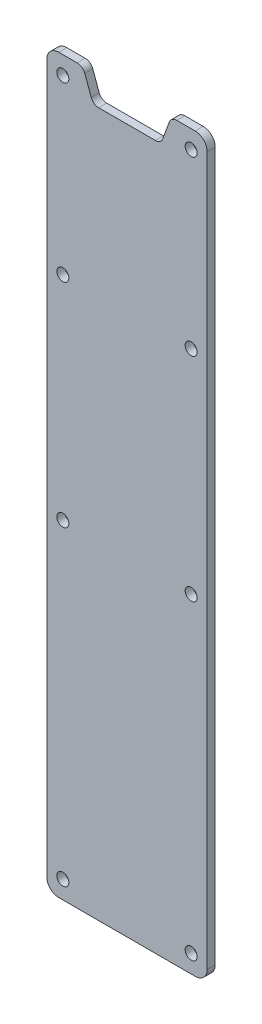
ISO-10303-21;
HEADER;
FILE_DESCRIPTION(('STEP AP214'),'2;1');
FILE_NAME('part.step','',(''),(''),'','','');
FILE_SCHEMA(('AUTOMOTIVE_DESIGN { 1 0 10303 214 1 1 1 1 }'));
ENDSEC;
DATA;
#1=APPLICATION_CONTEXT('core data for automotive mechanical design processes');
#2=APPLICATION_PROTOCOL_DEFINITION('international standard','automotive_design',2000,#1);
#3=PRODUCT_CONTEXT('',#1,'mechanical');
#4=PRODUCT('Part','Part','',(#3));
#5=PRODUCT_RELATED_PRODUCT_CATEGORY('part','',(#4));
#6=PRODUCT_DEFINITION_FORMATION('','',#4);
#7=PRODUCT_DEFINITION_CONTEXT('part definition',#1,'design');
#8=PRODUCT_DEFINITION('design','',#6,#7);
#9=PRODUCT_DEFINITION_SHAPE('','',#8);
#10=(LENGTH_UNIT() NAMED_UNIT(*) SI_UNIT(.MILLI.,.METRE.));
#11=(NAMED_UNIT(*) PLANE_ANGLE_UNIT() SI_UNIT($,.RADIAN.));
#12=(NAMED_UNIT(*) SI_UNIT($,.STERADIAN.) SOLID_ANGLE_UNIT());
#13=UNCERTAINTY_MEASURE_WITH_UNIT(LENGTH_MEASURE(1.E-05),#10,'distance_accuracy_value','');
#14=(GEOMETRIC_REPRESENTATION_CONTEXT(3) GLOBAL_UNCERTAINTY_ASSIGNED_CONTEXT((#13)) GLOBAL_UNIT_ASSIGNED_CONTEXT((#10,
#11,#12)) REPRESENTATION_CONTEXT('',''));
#15=CARTESIAN_POINT('',(0.,0.,0.));
#16=DIRECTION('',(0.,0.,1.));
#17=DIRECTION('',(1.,0.,0.));
#18=AXIS2_PLACEMENT_3D('',#15,#16,#17);
#19=CARTESIAN_POINT('',(17.,85.75,2.));
#20=DIRECTION('',(0.,0.,-1.));
#21=DIRECTION('',(-1.,0.,0.));
#22=AXIS2_PLACEMENT_3D('',#19,#20,#21);
#23=PLANE('',#22);
#24=CARTESIAN_POINT('',(-16.,84.25,2.));
#25=DIRECTION('',(0.,0.,1.));
#26=DIRECTION('',(1.,0.,0.));
#27=AXIS2_PLACEMENT_3D('',#24,#25,#26);
#28=CIRCLE('',#27,1.5);
#29=CARTESIAN_POINT('',(-14.5,84.25,2.));
#30=VERTEX_POINT('',#29);
#31=EDGE_CURVE('E202',#30,#30,#28,.T.);
#32=ORIENTED_EDGE('',*,*,#31,.F.);
#33=EDGE_LOOP('',(#32));
#34=FACE_BOUND('',#33,.T.);
#35=CARTESIAN_POINT('',(16.,84.25,2.));
#36=DIRECTION('',(0.,0.,1.));
#37=DIRECTION('',(1.,0.,0.));
#38=AXIS2_PLACEMENT_3D('',#35,#36,#37);
#39=CIRCLE('',#38,1.5);
#40=CARTESIAN_POINT('',(17.5,84.25,2.));
#41=VERTEX_POINT('',#40);
#42=EDGE_CURVE('E196',#41,#41,#39,.T.);
#43=ORIENTED_EDGE('',*,*,#42,.F.);
#44=EDGE_LOOP('',(#43));
#45=FACE_BOUND('',#44,.T.);
#46=CARTESIAN_POINT('',(-16.,41.25,2.));
#47=DIRECTION('',(0.,0.,1.));
#48=DIRECTION('',(1.,0.,0.));
#49=AXIS2_PLACEMENT_3D('',#46,#47,#48);
#50=CIRCLE('',#49,1.5);
#51=CARTESIAN_POINT('',(-14.5,41.25,2.));
#52=VERTEX_POINT('',#51);
#53=EDGE_CURVE('E190',#52,#52,#50,.T.);
#54=ORIENTED_EDGE('',*,*,#53,.F.);
#55=EDGE_LOOP('',(#54));
#56=FACE_BOUND('',#55,.T.);
#57=CARTESIAN_POINT('',(16.,41.25,2.));
#58=DIRECTION('',(0.,0.,1.));
#59=DIRECTION('',(1.,0.,0.));
#60=AXIS2_PLACEMENT_3D('',#57,#58,#59);
#61=CIRCLE('',#60,1.5);
#62=CARTESIAN_POINT('',(17.5,41.25,2.));
#63=VERTEX_POINT('',#62);
#64=EDGE_CURVE('E184',#63,#63,#61,.T.);
#65=ORIENTED_EDGE('',*,*,#64,.F.);
#66=EDGE_LOOP('',(#65));
#67=FACE_BOUND('',#66,.T.);
#68=CARTESIAN_POINT('',(-16.,-11.75,2.));
#69=DIRECTION('',(0.,0.,1.));
#70=DIRECTION('',(1.,0.,0.));
#71=AXIS2_PLACEMENT_3D('',#68,#69,#70);
#72=CIRCLE('',#71,1.5);
#73=CARTESIAN_POINT('',(-14.5,-11.75,2.));
#74=VERTEX_POINT('',#73);
#75=EDGE_CURVE('E178',#74,#74,#72,.T.);
#76=ORIENTED_EDGE('',*,*,#75,.F.);
#77=EDGE_LOOP('',(#76));
#78=FACE_BOUND('',#77,.T.);
#79=CARTESIAN_POINT('',(16.,-11.75,2.));
#80=DIRECTION('',(0.,0.,1.));
#81=DIRECTION('',(1.,0.,0.));
#82=AXIS2_PLACEMENT_3D('',#79,#80,#81);
#83=CIRCLE('',#82,1.5);
#84=CARTESIAN_POINT('',(17.5,-11.75,2.));
#85=VERTEX_POINT('',#84);
#86=EDGE_CURVE('E172',#85,#85,#83,.T.);
#87=ORIENTED_EDGE('',*,*,#86,.F.);
#88=EDGE_LOOP('',(#87));
#89=FACE_BOUND('',#88,.T.);
#90=CARTESIAN_POINT('',(-16.,-89.25,2.));
#91=DIRECTION('',(0.,0.,1.));
#92=DIRECTION('',(1.,0.,0.));
#93=AXIS2_PLACEMENT_3D('',#90,#91,#92);
#94=CIRCLE('',#93,1.5);
#95=CARTESIAN_POINT('',(-14.5,-89.25,2.));
#96=VERTEX_POINT('',#95);
#97=EDGE_CURVE('E166',#96,#96,#94,.T.);
#98=ORIENTED_EDGE('',*,*,#97,.F.);
#99=EDGE_LOOP('',(#98));
#100=FACE_BOUND('',#99,.T.);
#101=CARTESIAN_POINT('',(16.,-89.25,2.));
#102=DIRECTION('',(0.,0.,1.));
#103=DIRECTION('',(1.,0.,0.));
#104=AXIS2_PLACEMENT_3D('',#101,#102,#103);
#105=CIRCLE('',#104,1.5);
#106=CARTESIAN_POINT('',(17.5,-89.25,2.));
#107=VERTEX_POINT('',#106);
#108=EDGE_CURVE('E160',#107,#107,#105,.T.);
#109=ORIENTED_EDGE('',*,*,#108,.F.);
#110=EDGE_LOOP('',(#109));
#111=FACE_BOUND('',#110,.T.);
#112=DIRECTION('',(-1.,0.,0.));
#113=VECTOR('',#112,1.);
#114=CARTESIAN_POINT('',(-17.,88.75,2.));
#115=LINE('',#114,#113);
#116=CARTESIAN_POINT('',(17.,88.75,2.));
#117=VERTEX_POINT('',#116);
#118=CARTESIAN_POINT('',(12.4004150764194,88.75,2.));
#119=VERTEX_POINT('',#118);
#120=EDGE_CURVE('E112',#117,#119,#115,.T.);
#121=ORIENTED_EDGE('',*,*,#120,.T.);
#122=CARTESIAN_POINT('',(12.4004150764194,86.75,2.));
#123=DIRECTION('',(0.,0.,1.));
#124=DIRECTION('',(1.,0.,0.));
#125=AXIS2_PLACEMENT_3D('',#122,#123,#124);
#126=CIRCLE('',#125,2.);
#127=CARTESIAN_POINT('',(10.5210298348476,87.4340402866513,2.));
#128=VERTEX_POINT('',#127);
#129=EDGE_CURVE('E37',#128,#119,#126,.F.);
#130=ORIENTED_EDGE('',*,*,#129,.F.);
#131=DIRECTION('',(0.342020143325666,0.939692620785909,0.));
#132=VECTOR('',#131,1.);
#133=CARTESIAN_POINT('',(-18.8104557426856,6.84644598331924,2.));
#134=LINE('',#133,#132);
#135=CARTESIAN_POINT('',(8.93117852528898,83.0659597133486,2.));
#136=VERTEX_POINT('',#135);
#137=EDGE_CURVE('E85',#136,#128,#134,.T.);
#138=ORIENTED_EDGE('',*,*,#137,.F.);
#139=CARTESIAN_POINT('',(7.05179328371717,83.75,2.));
#140=DIRECTION('',(0.,0.,1.));
#141=DIRECTION('',(1.,0.,0.));
#142=AXIS2_PLACEMENT_3D('',#139,#140,#141);
#143=CIRCLE('',#142,2.);
#144=CARTESIAN_POINT('',(7.05179328371716,81.75,2.));
#145=VERTEX_POINT('',#144);
#146=EDGE_CURVE('E98',#145,#136,#143,.T.);
#147=ORIENTED_EDGE('',*,*,#146,.F.);
#148=DIRECTION('',(1.,0.,0.));
#149=VECTOR('',#148,1.);
#150=CARTESIAN_POINT('',(0.,81.75,2.));
#151=LINE('',#150,#149);
#152=CARTESIAN_POINT('',(-7.05179328371718,81.75,2.));
#153=VERTEX_POINT('',#152);
#154=EDGE_CURVE('E124',#153,#145,#151,.T.);
#155=ORIENTED_EDGE('',*,*,#154,.F.);
#156=CARTESIAN_POINT('',(-7.05179328371718,83.75,2.));
#157=DIRECTION('',(0.,0.,1.));
#158=DIRECTION('',(1.,0.,0.));
#159=AXIS2_PLACEMENT_3D('',#156,#157,#158);
#160=CIRCLE('',#159,2.);
#161=CARTESIAN_POINT('',(-8.931178525289,83.0659597133486,2.));
#162=VERTEX_POINT('',#161);
#163=EDGE_CURVE('E115',#162,#153,#160,.T.);
#164=ORIENTED_EDGE('',*,*,#163,.F.);
#165=DIRECTION('',(0.342020143325666,-0.939692620785909,0.));
#166=VECTOR('',#165,1.);
#167=CARTESIAN_POINT('',(18.8104557426856,6.84644598331925,2.));
#168=LINE('',#167,#166);
#169=CARTESIAN_POINT('',(-10.5210298348476,87.4340402866513,2.));
#170=VERTEX_POINT('',#169);
#171=EDGE_CURVE('E113',#170,#162,#168,.T.);
#172=ORIENTED_EDGE('',*,*,#171,.F.);
#173=CARTESIAN_POINT('',(-12.4004150764194,86.75,2.));
#174=DIRECTION('',(0.,0.,1.));
#175=DIRECTION('',(1.,0.,0.));
#176=AXIS2_PLACEMENT_3D('',#173,#174,#175);
#177=CIRCLE('',#176,2.);
#178=CARTESIAN_POINT('',(-12.4004150764194,88.75,2.));
#179=VERTEX_POINT('',#178);
#180=EDGE_CURVE('E114',#179,#170,#177,.F.);
#181=ORIENTED_EDGE('',*,*,#180,.F.);
#182=CARTESIAN_POINT('',(-17.,88.75,2.));
#183=VERTEX_POINT('',#182);
#184=EDGE_CURVE('E210',#179,#183,#115,.T.);
#185=ORIENTED_EDGE('',*,*,#184,.T.);
#186=CARTESIAN_POINT('',(-17.,85.75,2.));
#187=DIRECTION('',(0.,0.,1.));
#188=DIRECTION('',(1.,0.,0.));
#189=AXIS2_PLACEMENT_3D('',#186,#187,#188);
#190=CIRCLE('',#189,3.);
#191=CARTESIAN_POINT('',(-20.,85.75,2.));
#192=VERTEX_POINT('',#191);
#193=EDGE_CURVE('E214',#183,#192,#190,.T.);
#194=ORIENTED_EDGE('',*,*,#193,.T.);
#195=DIRECTION('',(0.,-1.,0.));
#196=VECTOR('',#195,1.);
#197=CARTESIAN_POINT('',(-20.,85.75,2.));
#198=LINE('',#197,#196);
#199=CARTESIAN_POINT('',(-20.,-90.75,2.));
#200=VERTEX_POINT('',#199);
#201=EDGE_CURVE('E217',#192,#200,#198,.T.);
#202=ORIENTED_EDGE('',*,*,#201,.T.);
#203=CARTESIAN_POINT('',(-17.,-90.75,2.));
#204=DIRECTION('',(0.,0.,1.));
#205=DIRECTION('',(1.,0.,0.));
#206=AXIS2_PLACEMENT_3D('',#203,#204,#205);
#207=CIRCLE('',#206,3.);
#208=CARTESIAN_POINT('',(-17.,-93.75,2.));
#209=VERTEX_POINT('',#208);
#210=EDGE_CURVE('E220',#200,#209,#207,.T.);
#211=ORIENTED_EDGE('',*,*,#210,.T.);
#212=DIRECTION('',(1.,0.,0.));
#213=VECTOR('',#212,1.);
#214=CARTESIAN_POINT('',(-17.,-93.75,2.));
#215=LINE('',#214,#213);
#216=CARTESIAN_POINT('',(17.,-93.75,2.));
#217=VERTEX_POINT('',#216);
#218=EDGE_CURVE('E223',#209,#217,#215,.T.);
#219=ORIENTED_EDGE('',*,*,#218,.T.);
#220=CARTESIAN_POINT('',(17.,-90.75,2.));
#221=DIRECTION('',(0.,0.,1.));
#222=DIRECTION('',(1.,0.,0.));
#223=AXIS2_PLACEMENT_3D('',#220,#221,#222);
#224=CIRCLE('',#223,3.);
#225=CARTESIAN_POINT('',(20.,-90.75,2.));
#226=VERTEX_POINT('',#225);
#227=EDGE_CURVE('E226',#217,#226,#224,.T.);
#228=ORIENTED_EDGE('',*,*,#227,.T.);
#229=DIRECTION('',(0.,1.,0.));
#230=VECTOR('',#229,1.);
#231=CARTESIAN_POINT('',(20.,85.75,2.));
#232=LINE('',#231,#230);
#233=CARTESIAN_POINT('',(20.,85.75,2.));
#234=VERTEX_POINT('',#233);
#235=EDGE_CURVE('E229',#226,#234,#232,.T.);
#236=ORIENTED_EDGE('',*,*,#235,.T.);
#237=CARTESIAN_POINT('',(17.,85.75,2.));
#238=DIRECTION('',(0.,0.,1.));
#239=DIRECTION('',(-1.,0.,0.));
#240=AXIS2_PLACEMENT_3D('',#237,#238,#239);
#241=CIRCLE('',#240,3.);
#242=EDGE_CURVE('E208',#234,#117,#241,.T.);
#243=ORIENTED_EDGE('',*,*,#242,.T.);
#244=EDGE_LOOP('',(#121,#130,#138,#147,#155,#164,#172,#181,#185,#194,#202,#211,#219,#228,#236,#243));
#245=FACE_BOUND('',#244,.T.);
#246=ADVANCED_FACE('F33',(#34,#45,#56,#67,#78,#89,#100,#111,#245),#23,.F.);
#247=CARTESIAN_POINT('',(17.,85.75,0.));
#248=DIRECTION('',(0.,0.,-1.));
#249=DIRECTION('',(-1.,0.,0.));
#250=AXIS2_PLACEMENT_3D('',#247,#248,#249);
#251=PLANE('',#250);
#252=CARTESIAN_POINT('',(16.,-89.25,0.));
#253=DIRECTION('',(0.,0.,1.));
#254=DIRECTION('',(1.,0.,0.));
#255=AXIS2_PLACEMENT_3D('',#252,#253,#254);
#256=CIRCLE('',#255,1.5);
#257=CARTESIAN_POINT('',(17.5,-89.25,0.));
#258=VERTEX_POINT('',#257);
#259=EDGE_CURVE('E97',#258,#258,#256,.T.);
#260=ORIENTED_EDGE('',*,*,#259,.T.);
#261=EDGE_LOOP('',(#260));
#262=FACE_BOUND('',#261,.T.);
#263=CARTESIAN_POINT('',(16.,-11.75,0.));
#264=DIRECTION('',(0.,0.,1.));
#265=DIRECTION('',(1.,0.,0.));
#266=AXIS2_PLACEMENT_3D('',#263,#264,#265);
#267=CIRCLE('',#266,1.5);
#268=CARTESIAN_POINT('',(17.5,-11.75,0.));
#269=VERTEX_POINT('',#268);
#270=EDGE_CURVE('E169',#269,#269,#267,.T.);
#271=ORIENTED_EDGE('',*,*,#270,.T.);
#272=EDGE_LOOP('',(#271));
#273=FACE_BOUND('',#272,.T.);
#274=CARTESIAN_POINT('',(16.,41.25,0.));
#275=DIRECTION('',(0.,0.,1.));
#276=DIRECTION('',(1.,0.,0.));
#277=AXIS2_PLACEMENT_3D('',#274,#275,#276);
#278=CIRCLE('',#277,1.5);
#279=CARTESIAN_POINT('',(17.5,41.25,0.));
#280=VERTEX_POINT('',#279);
#281=EDGE_CURVE('E181',#280,#280,#278,.T.);
#282=ORIENTED_EDGE('',*,*,#281,.T.);
#283=EDGE_LOOP('',(#282));
#284=FACE_BOUND('',#283,.T.);
#285=CARTESIAN_POINT('',(16.,84.25,0.));
#286=DIRECTION('',(0.,0.,1.));
#287=DIRECTION('',(1.,0.,0.));
#288=AXIS2_PLACEMENT_3D('',#285,#286,#287);
#289=CIRCLE('',#288,1.5);
#290=CARTESIAN_POINT('',(17.5,84.25,0.));
#291=VERTEX_POINT('',#290);
#292=EDGE_CURVE('E193',#291,#291,#289,.T.);
#293=ORIENTED_EDGE('',*,*,#292,.T.);
#294=EDGE_LOOP('',(#293));
#295=FACE_BOUND('',#294,.T.);
#296=CARTESIAN_POINT('',(-16.,84.25,0.));
#297=DIRECTION('',(0.,0.,1.));
#298=DIRECTION('',(1.,0.,0.));
#299=AXIS2_PLACEMENT_3D('',#296,#297,#298);
#300=CIRCLE('',#299,1.5);
#301=CARTESIAN_POINT('',(-14.5,84.25,0.));
#302=VERTEX_POINT('',#301);
#303=EDGE_CURVE('E199',#302,#302,#300,.T.);
#304=ORIENTED_EDGE('',*,*,#303,.T.);
#305=EDGE_LOOP('',(#304));
#306=FACE_BOUND('',#305,.T.);
#307=CARTESIAN_POINT('',(-16.,41.25,0.));
#308=DIRECTION('',(0.,0.,1.));
#309=DIRECTION('',(1.,0.,0.));
#310=AXIS2_PLACEMENT_3D('',#307,#308,#309);
#311=CIRCLE('',#310,1.5);
#312=CARTESIAN_POINT('',(-14.5,41.25,0.));
#313=VERTEX_POINT('',#312);
#314=EDGE_CURVE('E187',#313,#313,#311,.T.);
#315=ORIENTED_EDGE('',*,*,#314,.T.);
#316=EDGE_LOOP('',(#315));
#317=FACE_BOUND('',#316,.T.);
#318=CARTESIAN_POINT('',(-16.,-11.75,0.));
#319=DIRECTION('',(0.,0.,1.));
#320=DIRECTION('',(1.,0.,0.));
#321=AXIS2_PLACEMENT_3D('',#318,#319,#320);
#322=CIRCLE('',#321,1.5);
#323=CARTESIAN_POINT('',(-14.5,-11.75,0.));
#324=VERTEX_POINT('',#323);
#325=EDGE_CURVE('E175',#324,#324,#322,.T.);
#326=ORIENTED_EDGE('',*,*,#325,.T.);
#327=EDGE_LOOP('',(#326));
#328=FACE_BOUND('',#327,.T.);
#329=CARTESIAN_POINT('',(-16.,-89.25,0.));
#330=DIRECTION('',(0.,0.,1.));
#331=DIRECTION('',(1.,0.,0.));
#332=AXIS2_PLACEMENT_3D('',#329,#330,#331);
#333=CIRCLE('',#332,1.5);
#334=CARTESIAN_POINT('',(-14.5,-89.25,0.));
#335=VERTEX_POINT('',#334);
#336=EDGE_CURVE('E163',#335,#335,#333,.T.);
#337=ORIENTED_EDGE('',*,*,#336,.T.);
#338=EDGE_LOOP('',(#337));
#339=FACE_BOUND('',#338,.T.);
#340=CARTESIAN_POINT('',(12.4004150764194,86.75,0.));
#341=DIRECTION('',(0.,0.,1.));
#342=DIRECTION('',(1.,0.,0.));
#343=AXIS2_PLACEMENT_3D('',#340,#341,#342);
#344=CIRCLE('',#343,2.);
#345=CARTESIAN_POINT('',(10.5210298348476,87.4340402866513,0.));
#346=VERTEX_POINT('',#345);
#347=CARTESIAN_POINT('',(12.4004150764194,88.75,0.));
#348=VERTEX_POINT('',#347);
#349=EDGE_CURVE('E105',#346,#348,#344,.F.);
#350=ORIENTED_EDGE('',*,*,#349,.T.);
#351=DIRECTION('',(-1.,0.,0.));
#352=VECTOR('',#351,1.);
#353=CARTESIAN_POINT('',(-17.,88.75,0.));
#354=LINE('',#353,#352);
#355=CARTESIAN_POINT('',(17.,88.75,0.));
#356=VERTEX_POINT('',#355);
#357=EDGE_CURVE('E235',#356,#348,#354,.T.);
#358=ORIENTED_EDGE('',*,*,#357,.F.);
#359=CARTESIAN_POINT('',(17.,85.75,0.));
#360=DIRECTION('',(0.,0.,1.));
#361=DIRECTION('',(-1.,0.,0.));
#362=AXIS2_PLACEMENT_3D('',#359,#360,#361);
#363=CIRCLE('',#362,3.);
#364=CARTESIAN_POINT('',(20.,85.75,0.));
#365=VERTEX_POINT('',#364);
#366=EDGE_CURVE('E205',#365,#356,#363,.T.);
#367=ORIENTED_EDGE('',*,*,#366,.F.);
#368=DIRECTION('',(0.,1.,0.));
#369=VECTOR('',#368,1.);
#370=CARTESIAN_POINT('',(20.,85.75,0.));
#371=LINE('',#370,#369);
#372=CARTESIAN_POINT('',(20.,-90.75,0.));
#373=VERTEX_POINT('',#372);
#374=EDGE_CURVE('E211',#373,#365,#371,.T.);
#375=ORIENTED_EDGE('',*,*,#374,.F.);
#376=CARTESIAN_POINT('',(17.,-90.75,0.));
#377=DIRECTION('',(0.,0.,1.));
#378=DIRECTION('',(1.,0.,0.));
#379=AXIS2_PLACEMENT_3D('',#376,#377,#378);
#380=CIRCLE('',#379,3.);
#381=CARTESIAN_POINT('',(17.,-93.75,0.));
#382=VERTEX_POINT('',#381);
#383=EDGE_CURVE('E250',#382,#373,#380,.T.);
#384=ORIENTED_EDGE('',*,*,#383,.F.);
#385=DIRECTION('',(1.,0.,0.));
#386=VECTOR('',#385,1.);
#387=CARTESIAN_POINT('',(-17.,-93.75,0.));
#388=LINE('',#387,#386);
#389=CARTESIAN_POINT('',(-17.,-93.75,0.));
#390=VERTEX_POINT('',#389);
#391=EDGE_CURVE('E247',#390,#382,#388,.T.);
#392=ORIENTED_EDGE('',*,*,#391,.F.);
#393=CARTESIAN_POINT('',(-17.,-90.75,0.));
#394=DIRECTION('',(0.,0.,1.));
#395=DIRECTION('',(1.,0.,0.));
#396=AXIS2_PLACEMENT_3D('',#393,#394,#395);
#397=CIRCLE('',#396,3.);
#398=CARTESIAN_POINT('',(-20.,-90.75,0.));
#399=VERTEX_POINT('',#398);
#400=EDGE_CURVE('E244',#399,#390,#397,.T.);
#401=ORIENTED_EDGE('',*,*,#400,.F.);
#402=DIRECTION('',(0.,-1.,0.));
#403=VECTOR('',#402,1.);
#404=CARTESIAN_POINT('',(-20.,85.75,0.));
#405=LINE('',#404,#403);
#406=CARTESIAN_POINT('',(-20.,85.75,0.));
#407=VERTEX_POINT('',#406);
#408=EDGE_CURVE('E241',#407,#399,#405,.T.);
#409=ORIENTED_EDGE('',*,*,#408,.F.);
#410=CARTESIAN_POINT('',(-17.,85.75,0.));
#411=DIRECTION('',(0.,0.,1.));
#412=DIRECTION('',(1.,0.,0.));
#413=AXIS2_PLACEMENT_3D('',#410,#411,#412);
#414=CIRCLE('',#413,3.);
#415=CARTESIAN_POINT('',(-17.,88.75,0.));
#416=VERTEX_POINT('',#415);
#417=EDGE_CURVE('E238',#416,#407,#414,.T.);
#418=ORIENTED_EDGE('',*,*,#417,.F.);
#419=CARTESIAN_POINT('',(-12.4004150764194,88.75,0.));
#420=VERTEX_POINT('',#419);
#421=EDGE_CURVE('E234',#420,#416,#354,.T.);
#422=ORIENTED_EDGE('',*,*,#421,.F.);
#423=CARTESIAN_POINT('',(-12.4004150764194,86.75,0.));
#424=DIRECTION('',(0.,0.,1.));
#425=DIRECTION('',(1.,0.,0.));
#426=AXIS2_PLACEMENT_3D('',#423,#424,#425);
#427=CIRCLE('',#426,2.);
#428=CARTESIAN_POINT('',(-10.5210298348476,87.4340402866513,0.));
#429=VERTEX_POINT('',#428);
#430=EDGE_CURVE('E52',#420,#429,#427,.F.);
#431=ORIENTED_EDGE('',*,*,#430,.T.);
#432=DIRECTION('',(0.342020143325666,-0.939692620785909,0.));
#433=VECTOR('',#432,1.);
#434=CARTESIAN_POINT('',(18.8104557426856,6.84644598331925,0.));
#435=LINE('',#434,#433);
#436=CARTESIAN_POINT('',(-8.931178525289,83.0659597133487,0.));
#437=VERTEX_POINT('',#436);
#438=EDGE_CURVE('E395',#429,#437,#435,.T.);
#439=ORIENTED_EDGE('',*,*,#438,.T.);
#440=CARTESIAN_POINT('',(-7.05179328371718,83.75,0.));
#441=DIRECTION('',(0.,0.,1.));
#442=DIRECTION('',(1.,0.,0.));
#443=AXIS2_PLACEMENT_3D('',#440,#441,#442);
#444=CIRCLE('',#443,2.);
#445=CARTESIAN_POINT('',(-7.05179328371717,81.75,0.));
#446=VERTEX_POINT('',#445);
#447=EDGE_CURVE('E398',#437,#446,#444,.T.);
#448=ORIENTED_EDGE('',*,*,#447,.T.);
#449=DIRECTION('',(1.,0.,0.));
#450=VECTOR('',#449,1.);
#451=CARTESIAN_POINT('',(0.,81.75,0.));
#452=LINE('',#451,#450);
#453=CARTESIAN_POINT('',(7.05179328371716,81.75,0.));
#454=VERTEX_POINT('',#453);
#455=EDGE_CURVE('E145',#446,#454,#452,.T.);
#456=ORIENTED_EDGE('',*,*,#455,.T.);
#457=CARTESIAN_POINT('',(7.05179328371717,83.75,0.));
#458=DIRECTION('',(0.,0.,1.));
#459=DIRECTION('',(1.,0.,0.));
#460=AXIS2_PLACEMENT_3D('',#457,#458,#459);
#461=CIRCLE('',#460,2.);
#462=CARTESIAN_POINT('',(8.93117852528899,83.0659597133486,0.));
#463=VERTEX_POINT('',#462);
#464=EDGE_CURVE('E389',#454,#463,#461,.T.);
#465=ORIENTED_EDGE('',*,*,#464,.T.);
#466=DIRECTION('',(0.342020143325666,0.939692620785909,0.));
#467=VECTOR('',#466,1.);
#468=CARTESIAN_POINT('',(-18.8104557426856,6.84644598331924,0.));
#469=LINE('',#468,#467);
#470=EDGE_CURVE('E387',#463,#346,#469,.T.);
#471=ORIENTED_EDGE('',*,*,#470,.T.);
#472=EDGE_LOOP('',(#350,#358,#367,#375,#384,#392,#401,#409,#418,#422,#431,#439,#448,#456,#465,#471));
#473=FACE_BOUND('',#472,.T.);
#474=ADVANCED_FACE('F288',(#262,#273,#284,#295,#306,#317,#328,#339,#473),#251,.T.);
#475=CARTESIAN_POINT('',(-17.,88.75,2.));
#476=DIRECTION('',(0.,-1.,0.));
#477=DIRECTION('',(0.,0.,-1.));
#478=AXIS2_PLACEMENT_3D('',#475,#476,#477);
#479=PLANE('',#478);
#480=DIRECTION('',(0.,0.,1.));
#481=VECTOR('',#480,1.);
#482=CARTESIAN_POINT('',(12.4004150764194,88.75,0.));
#483=LINE('',#482,#481);
#484=EDGE_CURVE('E107',#348,#119,#483,.T.);
#485=ORIENTED_EDGE('',*,*,#484,.T.);
#486=ORIENTED_EDGE('',*,*,#120,.F.);
#487=DIRECTION('',(0.,0.,-1.));
#488=VECTOR('',#487,1.);
#489=CARTESIAN_POINT('',(17.,88.75,2.));
#490=LINE('',#489,#488);
#491=EDGE_CURVE('E11',#117,#356,#490,.T.);
#492=ORIENTED_EDGE('',*,*,#491,.T.);
#493=ORIENTED_EDGE('',*,*,#357,.T.);
#494=EDGE_LOOP('',(#485,#486,#492,#493));
#495=FACE_BOUND('',#494,.T.);
#496=ADVANCED_FACE('F352',(#495),#479,.F.);
#497=CARTESIAN_POINT('',(17.,85.75,2.));
#498=DIRECTION('',(0.,0.,-1.));
#499=DIRECTION('',(-1.,0.,0.));
#500=AXIS2_PLACEMENT_3D('',#497,#498,#499);
#501=CYLINDRICAL_SURFACE('',#500,3.);
#502=ORIENTED_EDGE('',*,*,#366,.T.);
#503=ORIENTED_EDGE('',*,*,#491,.F.);
#504=ORIENTED_EDGE('',*,*,#242,.F.);
#505=DIRECTION('',(0.,0.,-1.));
#506=VECTOR('',#505,1.);
#507=CARTESIAN_POINT('',(20.,85.75,2.));
#508=LINE('',#507,#506);
#509=EDGE_CURVE('E231',#234,#365,#508,.T.);
#510=ORIENTED_EDGE('',*,*,#509,.T.);
#511=EDGE_LOOP('',(#502,#503,#504,#510));
#512=FACE_BOUND('',#511,.T.);
#513=ADVANCED_FACE('F35',(#512),#501,.T.);
#514=ORIENTED_EDGE('',*,*,#184,.F.);
#515=DIRECTION('',(0.,0.,1.));
#516=VECTOR('',#515,1.);
#517=CARTESIAN_POINT('',(-12.4004150764194,88.75,0.));
#518=LINE('',#517,#516);
#519=EDGE_CURVE('E158',#420,#179,#518,.T.);
#520=ORIENTED_EDGE('',*,*,#519,.F.);
#521=ORIENTED_EDGE('',*,*,#421,.T.);
#522=DIRECTION('',(0.,0.,-1.));
#523=VECTOR('',#522,1.);
#524=CARTESIAN_POINT('',(-17.,88.75,2.));
#525=LINE('',#524,#523);
#526=EDGE_CURVE('E43',#183,#416,#525,.T.);
#527=ORIENTED_EDGE('',*,*,#526,.F.);
#528=EDGE_LOOP('',(#514,#520,#521,#527));
#529=FACE_BOUND('',#528,.T.);
#530=ADVANCED_FACE('F332',(#529),#479,.F.);
#531=CARTESIAN_POINT('',(-17.,85.75,2.));
#532=DIRECTION('',(0.,0.,-1.));
#533=DIRECTION('',(-1.,0.,0.));
#534=AXIS2_PLACEMENT_3D('',#531,#532,#533);
#535=CYLINDRICAL_SURFACE('',#534,3.);
#536=ORIENTED_EDGE('',*,*,#417,.T.);
#537=DIRECTION('',(0.,0.,-1.));
#538=VECTOR('',#537,1.);
#539=CARTESIAN_POINT('',(-20.,85.75,2.));
#540=LINE('',#539,#538);
#541=EDGE_CURVE('E269',#192,#407,#540,.T.);
#542=ORIENTED_EDGE('',*,*,#541,.F.);
#543=ORIENTED_EDGE('',*,*,#193,.F.);
#544=ORIENTED_EDGE('',*,*,#526,.T.);
#545=EDGE_LOOP('',(#536,#542,#543,#544));
#546=FACE_BOUND('',#545,.T.);
#547=ADVANCED_FACE('F277',(#546),#535,.T.);
#548=CARTESIAN_POINT('',(-20.,85.75,2.));
#549=DIRECTION('',(1.,0.,0.));
#550=DIRECTION('',(0.,1.,0.));
#551=AXIS2_PLACEMENT_3D('',#548,#549,#550);
#552=PLANE('',#551);
#553=ORIENTED_EDGE('',*,*,#408,.T.);
#554=DIRECTION('',(0.,0.,-1.));
#555=VECTOR('',#554,1.);
#556=CARTESIAN_POINT('',(-20.,-90.75,2.));
#557=LINE('',#556,#555);
#558=EDGE_CURVE('E266',#200,#399,#557,.T.);
#559=ORIENTED_EDGE('',*,*,#558,.F.);
#560=ORIENTED_EDGE('',*,*,#201,.F.);
#561=ORIENTED_EDGE('',*,*,#541,.T.);
#562=EDGE_LOOP('',(#553,#559,#560,#561));
#563=FACE_BOUND('',#562,.T.);
#564=ADVANCED_FACE('F295',(#563),#552,.F.);
#565=CARTESIAN_POINT('',(-17.,-90.75,2.));
#566=DIRECTION('',(0.,0.,-1.));
#567=DIRECTION('',(-1.,0.,0.));
#568=AXIS2_PLACEMENT_3D('',#565,#566,#567);
#569=CYLINDRICAL_SURFACE('',#568,3.);
#570=ORIENTED_EDGE('',*,*,#400,.T.);
#571=DIRECTION('',(0.,0.,-1.));
#572=VECTOR('',#571,1.);
#573=CARTESIAN_POINT('',(-17.,-93.75,2.));
#574=LINE('',#573,#572);
#575=EDGE_CURVE('E263',#209,#390,#574,.T.);
#576=ORIENTED_EDGE('',*,*,#575,.F.);
#577=ORIENTED_EDGE('',*,*,#210,.F.);
#578=ORIENTED_EDGE('',*,*,#558,.T.);
#579=EDGE_LOOP('',(#570,#576,#577,#578));
#580=FACE_BOUND('',#579,.T.);
#581=ADVANCED_FACE('F302',(#580),#569,.T.);
#582=CARTESIAN_POINT('',(-17.,-93.75,2.));
#583=DIRECTION('',(0.,1.,0.));
#584=DIRECTION('',(0.,0.,1.));
#585=AXIS2_PLACEMENT_3D('',#582,#583,#584);
#586=PLANE('',#585);
#587=ORIENTED_EDGE('',*,*,#391,.T.);
#588=DIRECTION('',(0.,0.,-1.));
#589=VECTOR('',#588,1.);
#590=CARTESIAN_POINT('',(17.,-93.75,2.));
#591=LINE('',#590,#589);
#592=EDGE_CURVE('E260',#217,#382,#591,.T.);
#593=ORIENTED_EDGE('',*,*,#592,.F.);
#594=ORIENTED_EDGE('',*,*,#218,.F.);
#595=ORIENTED_EDGE('',*,*,#575,.T.);
#596=EDGE_LOOP('',(#587,#593,#594,#595));
#597=FACE_BOUND('',#596,.T.);
#598=ADVANCED_FACE('F367',(#597),#586,.F.);
#599=CARTESIAN_POINT('',(17.,-90.75,2.));
#600=DIRECTION('',(0.,0.,-1.));
#601=DIRECTION('',(-1.,0.,0.));
#602=AXIS2_PLACEMENT_3D('',#599,#600,#601);
#603=CYLINDRICAL_SURFACE('',#602,3.);
#604=ORIENTED_EDGE('',*,*,#383,.T.);
#605=DIRECTION('',(0.,0.,-1.));
#606=VECTOR('',#605,1.);
#607=CARTESIAN_POINT('',(20.,-90.75,2.));
#608=LINE('',#607,#606);
#609=EDGE_CURVE('E257',#226,#373,#608,.T.);
#610=ORIENTED_EDGE('',*,*,#609,.F.);
#611=ORIENTED_EDGE('',*,*,#227,.F.);
#612=ORIENTED_EDGE('',*,*,#592,.T.);
#613=EDGE_LOOP('',(#604,#610,#611,#612));
#614=FACE_BOUND('',#613,.T.);
#615=ADVANCED_FACE('F364',(#614),#603,.T.);
#616=CARTESIAN_POINT('',(20.,85.75,2.));
#617=DIRECTION('',(-1.,0.,0.));
#618=DIRECTION('',(0.,-1.,0.));
#619=AXIS2_PLACEMENT_3D('',#616,#617,#618);
#620=PLANE('',#619);
#621=ORIENTED_EDGE('',*,*,#374,.T.);
#622=ORIENTED_EDGE('',*,*,#509,.F.);
#623=ORIENTED_EDGE('',*,*,#235,.F.);
#624=ORIENTED_EDGE('',*,*,#609,.T.);
#625=EDGE_LOOP('',(#621,#622,#623,#624));
#626=FACE_BOUND('',#625,.T.);
#627=ADVANCED_FACE('F361',(#626),#620,.F.);
#628=CARTESIAN_POINT('',(-16.,84.25,2.));
#629=DIRECTION('',(0.,0.,-1.));
#630=DIRECTION('',(-1.,0.,0.));
#631=AXIS2_PLACEMENT_3D('',#628,#629,#630);
#632=CYLINDRICAL_SURFACE('',#631,1.5);
#633=ORIENTED_EDGE('',*,*,#31,.T.);
#634=EDGE_LOOP('',(#633));
#635=FACE_BOUND('',#634,.T.);
#636=ORIENTED_EDGE('',*,*,#303,.F.);
#637=EDGE_LOOP('',(#636));
#638=FACE_BOUND('',#637,.T.);
#639=ADVANCED_FACE('F358',(#635,#638),#632,.F.);
#640=CARTESIAN_POINT('',(16.,84.25,2.));
#641=DIRECTION('',(0.,0.,-1.));
#642=DIRECTION('',(-1.,0.,0.));
#643=AXIS2_PLACEMENT_3D('',#640,#641,#642);
#644=CYLINDRICAL_SURFACE('',#643,1.5);
#645=ORIENTED_EDGE('',*,*,#42,.T.);
#646=EDGE_LOOP('',(#645));
#647=FACE_BOUND('',#646,.T.);
#648=ORIENTED_EDGE('',*,*,#292,.F.);
#649=EDGE_LOOP('',(#648));
#650=FACE_BOUND('',#649,.T.);
#651=ADVANCED_FACE('F445',(#647,#650),#644,.F.);
#652=CARTESIAN_POINT('',(-16.,41.25,2.));
#653=DIRECTION('',(0.,0.,-1.));
#654=DIRECTION('',(-1.,0.,0.));
#655=AXIS2_PLACEMENT_3D('',#652,#653,#654);
#656=CYLINDRICAL_SURFACE('',#655,1.5);
#657=ORIENTED_EDGE('',*,*,#53,.T.);
#658=EDGE_LOOP('',(#657));
#659=FACE_BOUND('',#658,.T.);
#660=ORIENTED_EDGE('',*,*,#314,.F.);
#661=EDGE_LOOP('',(#660));
#662=FACE_BOUND('',#661,.T.);
#663=ADVANCED_FACE('F442',(#659,#662),#656,.F.);
#664=CARTESIAN_POINT('',(16.,41.25,2.));
#665=DIRECTION('',(0.,0.,-1.));
#666=DIRECTION('',(-1.,0.,0.));
#667=AXIS2_PLACEMENT_3D('',#664,#665,#666);
#668=CYLINDRICAL_SURFACE('',#667,1.5);
#669=ORIENTED_EDGE('',*,*,#64,.T.);
#670=EDGE_LOOP('',(#669));
#671=FACE_BOUND('',#670,.T.);
#672=ORIENTED_EDGE('',*,*,#281,.F.);
#673=EDGE_LOOP('',(#672));
#674=FACE_BOUND('',#673,.T.);
#675=ADVANCED_FACE('F438',(#671,#674),#668,.F.);
#676=CARTESIAN_POINT('',(-16.,-11.75,2.));
#677=DIRECTION('',(0.,0.,-1.));
#678=DIRECTION('',(-1.,0.,0.));
#679=AXIS2_PLACEMENT_3D('',#676,#677,#678);
#680=CYLINDRICAL_SURFACE('',#679,1.5);
#681=ORIENTED_EDGE('',*,*,#75,.T.);
#682=EDGE_LOOP('',(#681));
#683=FACE_BOUND('',#682,.T.);
#684=ORIENTED_EDGE('',*,*,#325,.F.);
#685=EDGE_LOOP('',(#684));
#686=FACE_BOUND('',#685,.T.);
#687=ADVANCED_FACE('F434',(#683,#686),#680,.F.);
#688=CARTESIAN_POINT('',(16.,-11.75,2.));
#689=DIRECTION('',(0.,0.,-1.));
#690=DIRECTION('',(-1.,0.,0.));
#691=AXIS2_PLACEMENT_3D('',#688,#689,#690);
#692=CYLINDRICAL_SURFACE('',#691,1.5);
#693=ORIENTED_EDGE('',*,*,#86,.T.);
#694=EDGE_LOOP('',(#693));
#695=FACE_BOUND('',#694,.T.);
#696=ORIENTED_EDGE('',*,*,#270,.F.);
#697=EDGE_LOOP('',(#696));
#698=FACE_BOUND('',#697,.T.);
#699=ADVANCED_FACE('F427',(#695,#698),#692,.F.);
#700=CARTESIAN_POINT('',(-16.,-89.25,2.));
#701=DIRECTION('',(0.,0.,-1.));
#702=DIRECTION('',(-1.,0.,0.));
#703=AXIS2_PLACEMENT_3D('',#700,#701,#702);
#704=CYLINDRICAL_SURFACE('',#703,1.5);
#705=ORIENTED_EDGE('',*,*,#97,.T.);
#706=EDGE_LOOP('',(#705));
#707=FACE_BOUND('',#706,.T.);
#708=ORIENTED_EDGE('',*,*,#336,.F.);
#709=EDGE_LOOP('',(#708));
#710=FACE_BOUND('',#709,.T.);
#711=ADVANCED_FACE('F423',(#707,#710),#704,.F.);
#712=CARTESIAN_POINT('',(16.,-89.25,2.));
#713=DIRECTION('',(0.,0.,-1.));
#714=DIRECTION('',(-1.,0.,0.));
#715=AXIS2_PLACEMENT_3D('',#712,#713,#714);
#716=CYLINDRICAL_SURFACE('',#715,1.5);
#717=ORIENTED_EDGE('',*,*,#108,.T.);
#718=EDGE_LOOP('',(#717));
#719=FACE_BOUND('',#718,.T.);
#720=ORIENTED_EDGE('',*,*,#259,.F.);
#721=EDGE_LOOP('',(#720));
#722=FACE_BOUND('',#721,.T.);
#723=ADVANCED_FACE('F419',(#719,#722),#716,.F.);
#724=CARTESIAN_POINT('',(-18.8104557426856,6.84644598331924,0.));
#725=DIRECTION('',(0.939692620785909,-0.342020143325666,0.));
#726=DIRECTION('',(0.342020143325666,0.939692620785909,0.));
#727=AXIS2_PLACEMENT_3D('',#724,#725,#726);
#728=PLANE('',#727);
#729=DIRECTION('',(0.,0.,1.));
#730=VECTOR('',#729,1.);
#731=CARTESIAN_POINT('',(10.5210298348476,87.4340402866513,0.));
#732=LINE('',#731,#730);
#733=EDGE_CURVE('E90',#346,#128,#732,.T.);
#734=ORIENTED_EDGE('',*,*,#733,.F.);
#735=ORIENTED_EDGE('',*,*,#470,.F.);
#736=DIRECTION('',(0.,0.,1.));
#737=VECTOR('',#736,1.);
#738=CARTESIAN_POINT('',(8.93117852528899,83.0659597133486,0.));
#739=LINE('',#738,#737);
#740=EDGE_CURVE('E93',#463,#136,#739,.T.);
#741=ORIENTED_EDGE('',*,*,#740,.T.);
#742=ORIENTED_EDGE('',*,*,#137,.T.);
#743=EDGE_LOOP('',(#734,#735,#741,#742));
#744=FACE_BOUND('',#743,.T.);
#745=ADVANCED_FACE('F87',(#744),#728,.F.);
#746=CARTESIAN_POINT('',(7.05179328371717,83.75,0.));
#747=DIRECTION('',(0.,0.,1.));
#748=DIRECTION('',(1.,0.,0.));
#749=AXIS2_PLACEMENT_3D('',#746,#747,#748);
#750=CYLINDRICAL_SURFACE('',#749,2.);
#751=ORIENTED_EDGE('',*,*,#740,.F.);
#752=ORIENTED_EDGE('',*,*,#464,.F.);
#753=DIRECTION('',(0.,0.,1.));
#754=VECTOR('',#753,1.);
#755=CARTESIAN_POINT('',(7.05179328371716,81.75,0.));
#756=LINE('',#755,#754);
#757=EDGE_CURVE('E132',#454,#145,#756,.T.);
#758=ORIENTED_EDGE('',*,*,#757,.T.);
#759=ORIENTED_EDGE('',*,*,#146,.T.);
#760=EDGE_LOOP('',(#751,#752,#758,#759));
#761=FACE_BOUND('',#760,.T.);
#762=ADVANCED_FACE('F128',(#761),#750,.F.);
#763=CARTESIAN_POINT('',(0.,81.75,0.));
#764=DIRECTION('',(0.,-1.,0.));
#765=DIRECTION('',(0.,0.,-1.));
#766=AXIS2_PLACEMENT_3D('',#763,#764,#765);
#767=PLANE('',#766);
#768=ORIENTED_EDGE('',*,*,#757,.F.);
#769=ORIENTED_EDGE('',*,*,#455,.F.);
#770=DIRECTION('',(0.,0.,1.));
#771=VECTOR('',#770,1.);
#772=CARTESIAN_POINT('',(-7.05179328371717,81.75,0.));
#773=LINE('',#772,#771);
#774=EDGE_CURVE('E142',#446,#153,#773,.T.);
#775=ORIENTED_EDGE('',*,*,#774,.T.);
#776=ORIENTED_EDGE('',*,*,#154,.T.);
#777=EDGE_LOOP('',(#768,#769,#775,#776));
#778=FACE_BOUND('',#777,.T.);
#779=ADVANCED_FACE('F138',(#778),#767,.F.);
#780=CARTESIAN_POINT('',(-7.05179328371718,83.75,0.));
#781=DIRECTION('',(0.,0.,1.));
#782=DIRECTION('',(1.,0.,0.));
#783=AXIS2_PLACEMENT_3D('',#780,#781,#782);
#784=CYLINDRICAL_SURFACE('',#783,2.);
#785=ORIENTED_EDGE('',*,*,#774,.F.);
#786=ORIENTED_EDGE('',*,*,#447,.F.);
#787=DIRECTION('',(0.,0.,1.));
#788=VECTOR('',#787,1.);
#789=CARTESIAN_POINT('',(-8.931178525289,83.0659597133487,0.));
#790=LINE('',#789,#788);
#791=EDGE_CURVE('E149',#437,#162,#790,.T.);
#792=ORIENTED_EDGE('',*,*,#791,.T.);
#793=ORIENTED_EDGE('',*,*,#163,.T.);
#794=EDGE_LOOP('',(#785,#786,#792,#793));
#795=FACE_BOUND('',#794,.T.);
#796=ADVANCED_FACE('F407',(#795),#784,.F.);
#797=CARTESIAN_POINT('',(18.8104557426856,6.84644598331925,0.));
#798=DIRECTION('',(-0.939692620785909,-0.342020143325666,0.));
#799=DIRECTION('',(0.342020143325666,-0.939692620785909,0.));
#800=AXIS2_PLACEMENT_3D('',#797,#798,#799);
#801=PLANE('',#800);
#802=ORIENTED_EDGE('',*,*,#791,.F.);
#803=ORIENTED_EDGE('',*,*,#438,.F.);
#804=DIRECTION('',(0.,0.,1.));
#805=VECTOR('',#804,1.);
#806=CARTESIAN_POINT('',(-10.5210298348476,87.4340402866513,0.));
#807=LINE('',#806,#805);
#808=EDGE_CURVE('E153',#429,#170,#807,.T.);
#809=ORIENTED_EDGE('',*,*,#808,.T.);
#810=ORIENTED_EDGE('',*,*,#171,.T.);
#811=EDGE_LOOP('',(#802,#803,#809,#810));
#812=FACE_BOUND('',#811,.T.);
#813=ADVANCED_FACE('F341',(#812),#801,.F.);
#814=CARTESIAN_POINT('',(12.4004150764194,86.75,0.));
#815=DIRECTION('',(0.,0.,1.));
#816=DIRECTION('',(1.,0.,0.));
#817=AXIS2_PLACEMENT_3D('',#814,#815,#816);
#818=CYLINDRICAL_SURFACE('',#817,2.);
#819=ORIENTED_EDGE('',*,*,#484,.F.);
#820=ORIENTED_EDGE('',*,*,#349,.F.);
#821=ORIENTED_EDGE('',*,*,#733,.T.);
#822=ORIENTED_EDGE('',*,*,#129,.T.);
#823=EDGE_LOOP('',(#819,#820,#821,#822));
#824=FACE_BOUND('',#823,.T.);
#825=ADVANCED_FACE('F102',(#824),#818,.T.);
#826=CARTESIAN_POINT('',(-12.4004150764194,86.75,0.));
#827=DIRECTION('',(0.,0.,1.));
#828=DIRECTION('',(1.,0.,0.));
#829=AXIS2_PLACEMENT_3D('',#826,#827,#828);
#830=CYLINDRICAL_SURFACE('',#829,2.);
#831=ORIENTED_EDGE('',*,*,#808,.F.);
#832=ORIENTED_EDGE('',*,*,#430,.F.);
#833=ORIENTED_EDGE('',*,*,#519,.T.);
#834=ORIENTED_EDGE('',*,*,#180,.T.);
#835=EDGE_LOOP('',(#831,#832,#833,#834));
#836=FACE_BOUND('',#835,.T.);
#837=ADVANCED_FACE('F333',(#836),#830,.T.);
#838=CLOSED_SHELL('',(#246,#474,#496,#513,#530,#547,#564,#581,#598,#615,#627,#639,#651,#663,
#675,#687,#699,#711,#723,#745,#762,#779,#796,#813,#825,#837));
#839=MANIFOLD_SOLID_BREP('B2',#838);
#840=ADVANCED_BREP_SHAPE_REPRESENTATION('',(#18,#839),#14);
#841=SHAPE_DEFINITION_REPRESENTATION(#9,#840);
ENDSEC;
END-ISO-10303-21;
